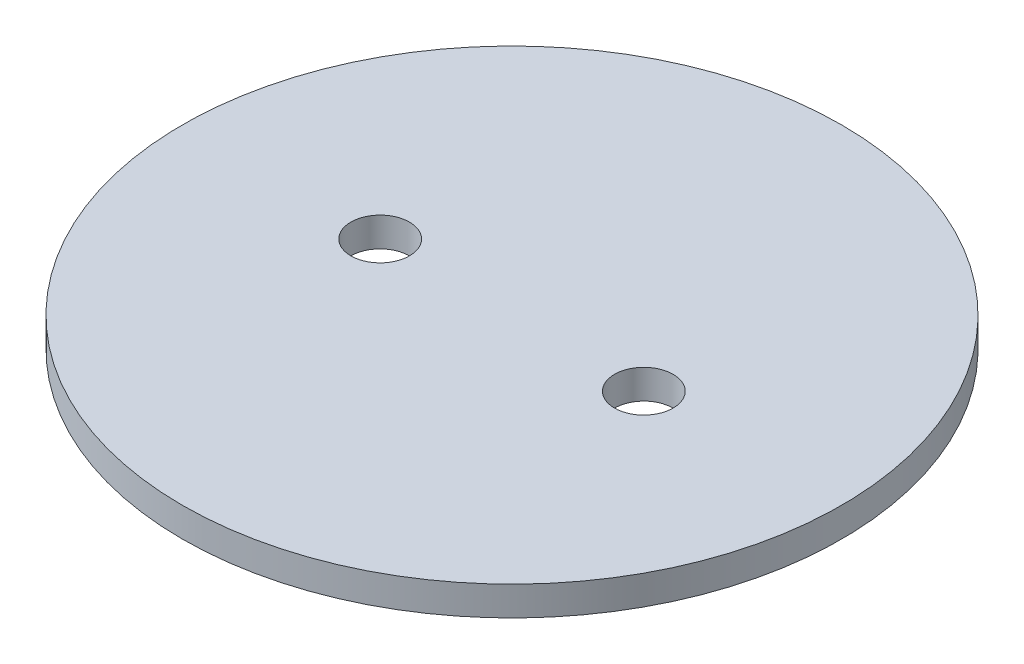
ISO-10303-21;
HEADER;
FILE_DESCRIPTION(('STEP AP214'),'2;1');
FILE_NAME('part.step','',(''),(''),'','','');
FILE_SCHEMA(('AUTOMOTIVE_DESIGN { 1 0 10303 214 1 1 1 1 }'));
ENDSEC;
DATA;
#1=APPLICATION_CONTEXT('core data for automotive mechanical design processes');
#2=APPLICATION_PROTOCOL_DEFINITION('international standard','automotive_design',2000,#1);
#3=PRODUCT_CONTEXT('',#1,'mechanical');
#4=PRODUCT('Part','Part','',(#3));
#5=PRODUCT_RELATED_PRODUCT_CATEGORY('part','',(#4));
#6=PRODUCT_DEFINITION_FORMATION('','',#4);
#7=PRODUCT_DEFINITION_CONTEXT('part definition',#1,'design');
#8=PRODUCT_DEFINITION('design','',#6,#7);
#9=PRODUCT_DEFINITION_SHAPE('','',#8);
#10=(LENGTH_UNIT() NAMED_UNIT(*) SI_UNIT(.MILLI.,.METRE.));
#11=(NAMED_UNIT(*) PLANE_ANGLE_UNIT() SI_UNIT($,.RADIAN.));
#12=(NAMED_UNIT(*) SI_UNIT($,.STERADIAN.) SOLID_ANGLE_UNIT());
#13=UNCERTAINTY_MEASURE_WITH_UNIT(LENGTH_MEASURE(1.E-05),#10,'distance_accuracy_value','');
#14=(GEOMETRIC_REPRESENTATION_CONTEXT(3) GLOBAL_UNCERTAINTY_ASSIGNED_CONTEXT((#13)) GLOBAL_UNIT_ASSIGNED_CONTEXT((#10,
#11,#12)) REPRESENTATION_CONTEXT('',''));
#15=CARTESIAN_POINT('',(0.,0.,0.));
#16=DIRECTION('',(0.,0.,1.));
#17=DIRECTION('',(1.,0.,0.));
#18=AXIS2_PLACEMENT_3D('',#15,#16,#17);
#19=CARTESIAN_POINT('',(0.,0.5,0.));
#20=DIRECTION('',(0.,1.,0.));
#21=DIRECTION('',(0.,0.,1.));
#22=AXIS2_PLACEMENT_3D('',#19,#20,#21);
#23=PLANE('',#22);
#24=CARTESIAN_POINT('',(-2.25,0.5,0.));
#25=DIRECTION('',(0.,1.,0.));
#26=DIRECTION('',(0.,0.,1.));
#27=AXIS2_PLACEMENT_3D('',#24,#25,#26);
#28=CIRCLE('',#27,0.5);
#29=CARTESIAN_POINT('',(-2.25,0.5,0.5));
#30=VERTEX_POINT('',#29);
#31=EDGE_CURVE('E56',#30,#30,#28,.T.);
#32=ORIENTED_EDGE('',*,*,#31,.F.);
#33=EDGE_LOOP('',(#32));
#34=FACE_BOUND('',#33,.T.);
#35=CARTESIAN_POINT('',(2.25,0.5,0.));
#36=DIRECTION('',(0.,1.,0.));
#37=DIRECTION('',(0.,0.,1.));
#38=AXIS2_PLACEMENT_3D('',#35,#36,#37);
#39=CIRCLE('',#38,0.5);
#40=CARTESIAN_POINT('',(2.25,0.5,0.5));
#41=VERTEX_POINT('',#40);
#42=EDGE_CURVE('E62',#41,#41,#39,.T.);
#43=ORIENTED_EDGE('',*,*,#42,.F.);
#44=EDGE_LOOP('',(#43));
#45=FACE_BOUND('',#44,.T.);
#46=CARTESIAN_POINT('',(0.,0.5,0.));
#47=DIRECTION('',(0.,1.,0.));
#48=DIRECTION('',(0.,0.,1.));
#49=AXIS2_PLACEMENT_3D('',#46,#47,#48);
#50=CIRCLE('',#49,5.625);
#51=CARTESIAN_POINT('',(0.,0.5,5.625));
#52=VERTEX_POINT('',#51);
#53=EDGE_CURVE('E65',#52,#52,#50,.T.);
#54=ORIENTED_EDGE('',*,*,#53,.T.);
#55=EDGE_LOOP('',(#54));
#56=FACE_BOUND('',#55,.T.);
#57=ADVANCED_FACE('F47',(#34,#45,#56),#23,.T.);
#58=CARTESIAN_POINT('',(0.,0.,0.));
#59=DIRECTION('',(0.,1.,0.));
#60=DIRECTION('',(0.,0.,1.));
#61=AXIS2_PLACEMENT_3D('',#58,#59,#60);
#62=PLANE('',#61);
#63=CARTESIAN_POINT('',(-2.25,0.,0.));
#64=DIRECTION('',(0.,1.,0.));
#65=DIRECTION('',(0.,0.,1.));
#66=AXIS2_PLACEMENT_3D('',#63,#64,#65);
#67=CIRCLE('',#66,0.5);
#68=CARTESIAN_POINT('',(-2.25,0.,0.5));
#69=VERTEX_POINT('',#68);
#70=EDGE_CURVE('E11',#69,#69,#67,.T.);
#71=ORIENTED_EDGE('',*,*,#70,.T.);
#72=EDGE_LOOP('',(#71));
#73=FACE_BOUND('',#72,.T.);
#74=CARTESIAN_POINT('',(2.25,0.,0.));
#75=DIRECTION('',(0.,1.,0.));
#76=DIRECTION('',(0.,0.,1.));
#77=AXIS2_PLACEMENT_3D('',#74,#75,#76);
#78=CIRCLE('',#77,0.5);
#79=CARTESIAN_POINT('',(2.25,0.,0.5));
#80=VERTEX_POINT('',#79);
#81=EDGE_CURVE('E51',#80,#80,#78,.T.);
#82=ORIENTED_EDGE('',*,*,#81,.T.);
#83=EDGE_LOOP('',(#82));
#84=FACE_BOUND('',#83,.T.);
#85=CARTESIAN_POINT('',(0.,0.,0.));
#86=DIRECTION('',(0.,1.,0.));
#87=DIRECTION('',(0.,0.,1.));
#88=AXIS2_PLACEMENT_3D('',#85,#86,#87);
#89=CIRCLE('',#88,5.625);
#90=CARTESIAN_POINT('',(0.,0.,5.625));
#91=VERTEX_POINT('',#90);
#92=EDGE_CURVE('E73',#91,#91,#89,.T.);
#93=ORIENTED_EDGE('',*,*,#92,.F.);
#94=EDGE_LOOP('',(#93));
#95=FACE_BOUND('',#94,.T.);
#96=ADVANCED_FACE('F49',(#73,#84,#95),#62,.F.);
#97=CARTESIAN_POINT('',(2.25,0.,0.));
#98=DIRECTION('',(0.,1.,0.));
#99=DIRECTION('',(0.,0.,1.));
#100=AXIS2_PLACEMENT_3D('',#97,#98,#99);
#101=CYLINDRICAL_SURFACE('',#100,0.5);
#102=ORIENTED_EDGE('',*,*,#81,.F.);
#103=EDGE_LOOP('',(#102));
#104=FACE_BOUND('',#103,.T.);
#105=ORIENTED_EDGE('',*,*,#42,.T.);
#106=EDGE_LOOP('',(#105));
#107=FACE_BOUND('',#106,.T.);
#108=ADVANCED_FACE('F92',(#104,#107),#101,.F.);
#109=CARTESIAN_POINT('',(-2.25,0.,0.));
#110=DIRECTION('',(0.,1.,0.));
#111=DIRECTION('',(0.,0.,1.));
#112=AXIS2_PLACEMENT_3D('',#109,#110,#111);
#113=CYLINDRICAL_SURFACE('',#112,0.5);
#114=ORIENTED_EDGE('',*,*,#70,.F.);
#115=EDGE_LOOP('',(#114));
#116=FACE_BOUND('',#115,.T.);
#117=ORIENTED_EDGE('',*,*,#31,.T.);
#118=EDGE_LOOP('',(#117));
#119=FACE_BOUND('',#118,.T.);
#120=ADVANCED_FACE('F87',(#116,#119),#113,.F.);
#121=CARTESIAN_POINT('',(0.,0.,0.));
#122=DIRECTION('',(0.,1.,0.));
#123=DIRECTION('',(0.,0.,1.));
#124=AXIS2_PLACEMENT_3D('',#121,#122,#123);
#125=CYLINDRICAL_SURFACE('',#124,5.625);
#126=ORIENTED_EDGE('',*,*,#92,.T.);
#127=EDGE_LOOP('',(#126));
#128=FACE_BOUND('',#127,.T.);
#129=ORIENTED_EDGE('',*,*,#53,.F.);
#130=EDGE_LOOP('',(#129));
#131=FACE_BOUND('',#130,.T.);
#132=ADVANCED_FACE('F85',(#128,#131),#125,.T.);
#133=CLOSED_SHELL('',(#57,#96,#108,#120,#132));
#134=MANIFOLD_SOLID_BREP('B2',#133);
#135=ADVANCED_BREP_SHAPE_REPRESENTATION('',(#18,#134),#14);
#136=SHAPE_DEFINITION_REPRESENTATION(#9,#135);
ENDSEC;
END-ISO-10303-21;
